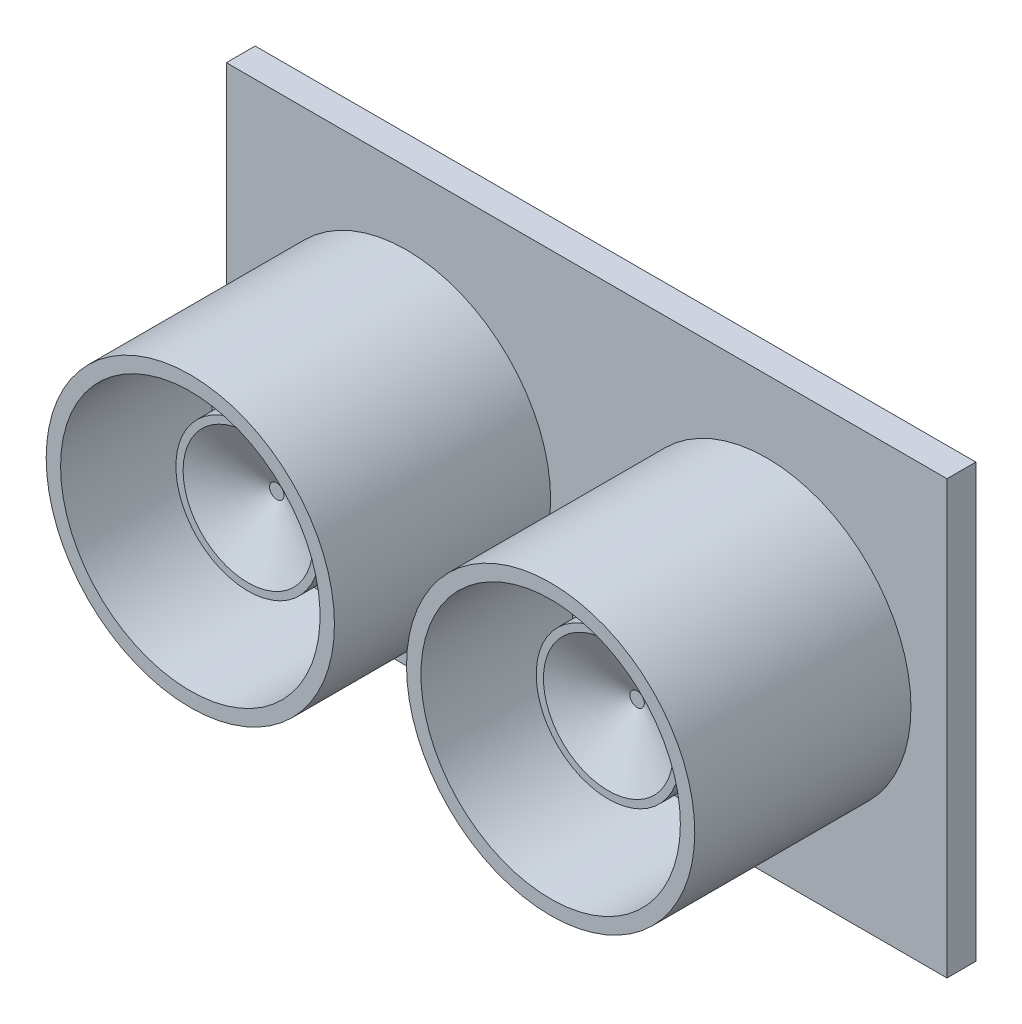
ISO-10303-21;
HEADER;
FILE_DESCRIPTION(('STEP AP214'),'2;1');
FILE_NAME('part.step','',(''),(''),'','','');
FILE_SCHEMA(('AUTOMOTIVE_DESIGN { 1 0 10303 214 1 1 1 1 }'));
ENDSEC;
DATA;
#1=APPLICATION_CONTEXT('core data for automotive mechanical design processes');
#2=APPLICATION_PROTOCOL_DEFINITION('international standard','automotive_design',2000,#1);
#3=PRODUCT_CONTEXT('',#1,'mechanical');
#4=PRODUCT('Part','Part','',(#3));
#5=PRODUCT_RELATED_PRODUCT_CATEGORY('part','',(#4));
#6=PRODUCT_DEFINITION_FORMATION('','',#4);
#7=PRODUCT_DEFINITION_CONTEXT('part definition',#1,'design');
#8=PRODUCT_DEFINITION('design','',#6,#7);
#9=PRODUCT_DEFINITION_SHAPE('','',#8);
#10=(LENGTH_UNIT() NAMED_UNIT(*) SI_UNIT(.MILLI.,.METRE.));
#11=(NAMED_UNIT(*) PLANE_ANGLE_UNIT() SI_UNIT($,.RADIAN.));
#12=(NAMED_UNIT(*) SI_UNIT($,.STERADIAN.) SOLID_ANGLE_UNIT());
#13=UNCERTAINTY_MEASURE_WITH_UNIT(LENGTH_MEASURE(1.E-05),#10,'distance_accuracy_value','');
#14=(GEOMETRIC_REPRESENTATION_CONTEXT(3) GLOBAL_UNCERTAINTY_ASSIGNED_CONTEXT((#13)) GLOBAL_UNIT_ASSIGNED_CONTEXT((#10,
#11,#12)) REPRESENTATION_CONTEXT('',''));
#15=CARTESIAN_POINT('',(0.,0.,0.));
#16=DIRECTION('',(0.,0.,1.));
#17=DIRECTION('',(1.,0.,0.));
#18=AXIS2_PLACEMENT_3D('',#15,#16,#17);
#19=CARTESIAN_POINT('',(25.,-15.,2.));
#20=DIRECTION('',(-1.,0.,0.));
#21=DIRECTION('',(0.,0.,1.));
#22=AXIS2_PLACEMENT_3D('',#19,#20,#21);
#23=PLANE('',#22);
#24=DIRECTION('',(0.,1.,0.));
#25=VECTOR('',#24,1.);
#26=CARTESIAN_POINT('',(25.,-15.,0.));
#27=LINE('',#26,#25);
#28=CARTESIAN_POINT('',(25.,-15.,0.));
#29=VERTEX_POINT('',#28);
#30=CARTESIAN_POINT('',(25.,15.,0.));
#31=VERTEX_POINT('',#30);
#32=EDGE_CURVE('E102',#29,#31,#27,.T.);
#33=ORIENTED_EDGE('',*,*,#32,.T.);
#34=DIRECTION('',(0.,0.,-1.));
#35=VECTOR('',#34,1.);
#36=CARTESIAN_POINT('',(25.,15.,2.));
#37=LINE('',#36,#35);
#38=CARTESIAN_POINT('',(25.,15.,2.));
#39=VERTEX_POINT('',#38);
#40=EDGE_CURVE('E93',#39,#31,#37,.T.);
#41=ORIENTED_EDGE('',*,*,#40,.F.);
#42=DIRECTION('',(0.,1.,0.));
#43=VECTOR('',#42,1.);
#44=CARTESIAN_POINT('',(25.,-15.,2.));
#45=LINE('',#44,#43);
#46=CARTESIAN_POINT('',(25.,-15.,2.));
#47=VERTEX_POINT('',#46);
#48=EDGE_CURVE('E87',#47,#39,#45,.T.);
#49=ORIENTED_EDGE('',*,*,#48,.F.);
#50=DIRECTION('',(0.,0.,-1.));
#51=VECTOR('',#50,1.);
#52=CARTESIAN_POINT('',(25.,-15.,2.));
#53=LINE('',#52,#51);
#54=EDGE_CURVE('E98',#47,#29,#53,.T.);
#55=ORIENTED_EDGE('',*,*,#54,.T.);
#56=EDGE_LOOP('',(#33,#41,#49,#55));
#57=FACE_BOUND('',#56,.T.);
#58=ADVANCED_FACE('F33',(#57),#23,.F.);
#59=CARTESIAN_POINT('',(-25.,15.,2.));
#60=DIRECTION('',(0.,-1.,0.));
#61=DIRECTION('',(0.,0.,-1.));
#62=AXIS2_PLACEMENT_3D('',#59,#60,#61);
#63=PLANE('',#62);
#64=DIRECTION('',(-1.,0.,0.));
#65=VECTOR('',#64,1.);
#66=CARTESIAN_POINT('',(-25.,15.,0.));
#67=LINE('',#66,#65);
#68=CARTESIAN_POINT('',(-25.,15.,0.));
#69=VERTEX_POINT('',#68);
#70=EDGE_CURVE('E92',#31,#69,#67,.T.);
#71=ORIENTED_EDGE('',*,*,#70,.T.);
#72=DIRECTION('',(0.,0.,-1.));
#73=VECTOR('',#72,1.);
#74=CARTESIAN_POINT('',(-25.,15.,2.));
#75=LINE('',#74,#73);
#76=CARTESIAN_POINT('',(-25.,15.,2.));
#77=VERTEX_POINT('',#76);
#78=EDGE_CURVE('E90',#77,#69,#75,.T.);
#79=ORIENTED_EDGE('',*,*,#78,.F.);
#80=DIRECTION('',(-1.,0.,0.));
#81=VECTOR('',#80,1.);
#82=CARTESIAN_POINT('',(-25.,15.,2.));
#83=LINE('',#82,#81);
#84=EDGE_CURVE('E82',#39,#77,#83,.T.);
#85=ORIENTED_EDGE('',*,*,#84,.F.);
#86=ORIENTED_EDGE('',*,*,#40,.T.);
#87=EDGE_LOOP('',(#71,#79,#85,#86));
#88=FACE_BOUND('',#87,.T.);
#89=ADVANCED_FACE('F91',(#88),#63,.F.);
#90=CARTESIAN_POINT('',(-25.,-15.,2.));
#91=DIRECTION('',(1.,0.,0.));
#92=DIRECTION('',(0.,0.,-1.));
#93=AXIS2_PLACEMENT_3D('',#90,#91,#92);
#94=PLANE('',#93);
#95=DIRECTION('',(0.,-1.,0.));
#96=VECTOR('',#95,1.);
#97=CARTESIAN_POINT('',(-25.,-15.,0.));
#98=LINE('',#97,#96);
#99=CARTESIAN_POINT('',(-25.,-15.,0.));
#100=VERTEX_POINT('',#99);
#101=EDGE_CURVE('E68',#69,#100,#98,.T.);
#102=ORIENTED_EDGE('',*,*,#101,.T.);
#103=DIRECTION('',(0.,0.,-1.));
#104=VECTOR('',#103,1.);
#105=CARTESIAN_POINT('',(-25.,-15.,2.));
#106=LINE('',#105,#104);
#107=CARTESIAN_POINT('',(-25.,-15.,2.));
#108=VERTEX_POINT('',#107);
#109=EDGE_CURVE('E94',#108,#100,#106,.T.);
#110=ORIENTED_EDGE('',*,*,#109,.F.);
#111=DIRECTION('',(0.,-1.,0.));
#112=VECTOR('',#111,1.);
#113=CARTESIAN_POINT('',(-25.,-15.,2.));
#114=LINE('',#113,#112);
#115=EDGE_CURVE('E85',#77,#108,#114,.T.);
#116=ORIENTED_EDGE('',*,*,#115,.F.);
#117=ORIENTED_EDGE('',*,*,#78,.T.);
#118=EDGE_LOOP('',(#102,#110,#116,#117));
#119=FACE_BOUND('',#118,.T.);
#120=ADVANCED_FACE('F96',(#119),#94,.F.);
#121=CARTESIAN_POINT('',(-25.,-15.,2.));
#122=DIRECTION('',(0.,1.,0.));
#123=DIRECTION('',(0.,0.,1.));
#124=AXIS2_PLACEMENT_3D('',#121,#122,#123);
#125=PLANE('',#124);
#126=DIRECTION('',(1.,0.,0.));
#127=VECTOR('',#126,1.);
#128=CARTESIAN_POINT('',(-25.,-15.,0.));
#129=LINE('',#128,#127);
#130=EDGE_CURVE('E74',#100,#29,#129,.T.);
#131=ORIENTED_EDGE('',*,*,#130,.T.);
#132=ORIENTED_EDGE('',*,*,#54,.F.);
#133=DIRECTION('',(1.,0.,0.));
#134=VECTOR('',#133,1.);
#135=CARTESIAN_POINT('',(-25.,-15.,2.));
#136=LINE('',#135,#134);
#137=EDGE_CURVE('E51',#108,#47,#136,.T.);
#138=ORIENTED_EDGE('',*,*,#137,.F.);
#139=ORIENTED_EDGE('',*,*,#109,.T.);
#140=EDGE_LOOP('',(#131,#132,#138,#139));
#141=FACE_BOUND('',#140,.T.);
#142=ADVANCED_FACE('F167',(#141),#125,.F.);
#143=CARTESIAN_POINT('',(0.,0.,2.));
#144=DIRECTION('',(0.,0.,-1.));
#145=DIRECTION('',(-1.,0.,0.));
#146=AXIS2_PLACEMENT_3D('',#143,#144,#145);
#147=PLANE('',#146);
#148=CARTESIAN_POINT('',(-12.5,0.,2.));
#149=DIRECTION('',(0.,0.,-1.));
#150=DIRECTION('',(-1.,0.,0.));
#151=AXIS2_PLACEMENT_3D('',#148,#149,#150);
#152=CIRCLE('',#151,10.);
#153=CARTESIAN_POINT('',(-22.5,0.,2.));
#154=VERTEX_POINT('',#153);
#155=EDGE_CURVE('E115',#154,#154,#152,.F.);
#156=ORIENTED_EDGE('',*,*,#155,.F.);
#157=EDGE_LOOP('',(#156));
#158=FACE_BOUND('',#157,.T.);
#159=CARTESIAN_POINT('',(12.5,0.,2.));
#160=DIRECTION('',(0.,0.,-1.));
#161=DIRECTION('',(-1.,0.,0.));
#162=AXIS2_PLACEMENT_3D('',#159,#160,#161);
#163=CIRCLE('',#162,10.);
#164=CARTESIAN_POINT('',(2.50000000000001,0.,2.));
#165=VERTEX_POINT('',#164);
#166=EDGE_CURVE('E112',#165,#165,#163,.F.);
#167=ORIENTED_EDGE('',*,*,#166,.F.);
#168=EDGE_LOOP('',(#167));
#169=FACE_BOUND('',#168,.T.);
#170=ORIENTED_EDGE('',*,*,#48,.T.);
#171=ORIENTED_EDGE('',*,*,#84,.T.);
#172=ORIENTED_EDGE('',*,*,#115,.T.);
#173=ORIENTED_EDGE('',*,*,#137,.T.);
#174=EDGE_LOOP('',(#170,#171,#172,#173));
#175=FACE_BOUND('',#174,.T.);
#176=ADVANCED_FACE('F83',(#158,#169,#175),#147,.F.);
#177=CARTESIAN_POINT('',(0.,0.,0.));
#178=DIRECTION('',(0.,0.,-1.));
#179=DIRECTION('',(-1.,0.,0.));
#180=AXIS2_PLACEMENT_3D('',#177,#178,#179);
#181=PLANE('',#180);
#182=ORIENTED_EDGE('',*,*,#32,.F.);
#183=ORIENTED_EDGE('',*,*,#130,.F.);
#184=ORIENTED_EDGE('',*,*,#101,.F.);
#185=ORIENTED_EDGE('',*,*,#70,.F.);
#186=EDGE_LOOP('',(#182,#183,#184,#185));
#187=FACE_BOUND('',#186,.T.);
#188=ADVANCED_FACE('F166',(#187),#181,.T.);
#189=CARTESIAN_POINT('',(12.5,0.,17.));
#190=DIRECTION('',(0.,0.,1.));
#191=DIRECTION('',(1.,0.,0.));
#192=AXIS2_PLACEMENT_3D('',#189,#190,#191);
#193=PLANE('',#192);
#194=CARTESIAN_POINT('',(12.5,0.,17.));
#195=DIRECTION('',(0.,0.,1.));
#196=DIRECTION('',(1.,0.,0.));
#197=AXIS2_PLACEMENT_3D('',#194,#195,#196);
#198=CIRCLE('',#197,10.);
#199=CARTESIAN_POINT('',(22.5,0.,17.));
#200=VERTEX_POINT('',#199);
#201=EDGE_CURVE('E105',#200,#200,#198,.T.);
#202=ORIENTED_EDGE('',*,*,#201,.T.);
#203=EDGE_LOOP('',(#202));
#204=FACE_BOUND('',#203,.T.);
#205=CARTESIAN_POINT('',(12.5,0.,17.));
#206=DIRECTION('',(0.,0.,1.));
#207=DIRECTION('',(1.,0.,0.));
#208=AXIS2_PLACEMENT_3D('',#205,#206,#207);
#209=CIRCLE('',#208,9.);
#210=CARTESIAN_POINT('',(21.5,0.,17.));
#211=VERTEX_POINT('',#210);
#212=EDGE_CURVE('E147',#211,#211,#209,.T.);
#213=ORIENTED_EDGE('',*,*,#212,.F.);
#214=EDGE_LOOP('',(#213));
#215=FACE_BOUND('',#214,.T.);
#216=ADVANCED_FACE('F155',(#204,#215),#193,.T.);
#217=CARTESIAN_POINT('',(12.5,0.,17.));
#218=DIRECTION('',(0.,0.,-1.));
#219=DIRECTION('',(-1.,0.,0.));
#220=AXIS2_PLACEMENT_3D('',#217,#218,#219);
#221=CYLINDRICAL_SURFACE('',#220,10.);
#222=ORIENTED_EDGE('',*,*,#201,.F.);
#223=EDGE_LOOP('',(#222));
#224=FACE_BOUND('',#223,.T.);
#225=ORIENTED_EDGE('',*,*,#166,.T.);
#226=EDGE_LOOP('',(#225));
#227=FACE_BOUND('',#226,.T.);
#228=ADVANCED_FACE('F158',(#224,#227),#221,.T.);
#229=CARTESIAN_POINT('',(12.5,0.,17.));
#230=DIRECTION('',(0.,0.,-1.));
#231=DIRECTION('',(-1.,0.,0.));
#232=AXIS2_PLACEMENT_3D('',#229,#230,#231);
#233=CYLINDRICAL_SURFACE('',#232,9.);
#234=ORIENTED_EDGE('',*,*,#212,.T.);
#235=EDGE_LOOP('',(#234));
#236=FACE_BOUND('',#235,.T.);
#237=CARTESIAN_POINT('',(12.5,0.,2.));
#238=DIRECTION('',(0.,0.,1.));
#239=DIRECTION('',(1.,0.,0.));
#240=AXIS2_PLACEMENT_3D('',#237,#238,#239);
#241=CIRCLE('',#240,9.);
#242=CARTESIAN_POINT('',(21.5,0.,2.));
#243=VERTEX_POINT('',#242);
#244=EDGE_CURVE('E146',#243,#243,#241,.T.);
#245=ORIENTED_EDGE('',*,*,#244,.F.);
#246=EDGE_LOOP('',(#245));
#247=FACE_BOUND('',#246,.T.);
#248=ADVANCED_FACE('F161',(#236,#247),#233,.F.);
#249=CARTESIAN_POINT('',(12.5,0.,2.));
#250=DIRECTION('',(0.,0.,-1.));
#251=DIRECTION('',(-1.,0.,0.));
#252=AXIS2_PLACEMENT_3D('',#249,#250,#251);
#253=CIRCLE('',#252,7.5);
#254=CARTESIAN_POINT('',(5.00000000000001,0.,2.));
#255=VERTEX_POINT('',#254);
#256=EDGE_CURVE('E117',#255,#255,#253,.F.);
#257=ORIENTED_EDGE('',*,*,#256,.F.);
#258=EDGE_LOOP('',(#257));
#259=FACE_BOUND('',#258,.T.);
#260=ORIENTED_EDGE('',*,*,#244,.T.);
#261=EDGE_LOOP('',(#260));
#262=FACE_BOUND('',#261,.T.);
#263=ADVANCED_FACE('F171',(#259,#262),#147,.F.);
#264=CARTESIAN_POINT('',(-12.5,0.,17.));
#265=DIRECTION('',(0.,0.,-1.));
#266=DIRECTION('',(-1.,0.,0.));
#267=AXIS2_PLACEMENT_3D('',#264,#265,#266);
#268=PLANE('',#267);
#269=CARTESIAN_POINT('',(-12.5,0.,17.));
#270=DIRECTION('',(0.,0.,1.));
#271=DIRECTION('',(-1.,0.,0.));
#272=AXIS2_PLACEMENT_3D('',#269,#270,#271);
#273=CIRCLE('',#272,10.);
#274=CARTESIAN_POINT('',(-22.5,0.,17.));
#275=VERTEX_POINT('',#274);
#276=EDGE_CURVE('E141',#275,#275,#273,.T.);
#277=ORIENTED_EDGE('',*,*,#276,.T.);
#278=EDGE_LOOP('',(#277));
#279=FACE_BOUND('',#278,.T.);
#280=CARTESIAN_POINT('',(-12.5,0.,17.));
#281=DIRECTION('',(0.,0.,1.));
#282=DIRECTION('',(-1.,0.,0.));
#283=AXIS2_PLACEMENT_3D('',#280,#281,#282);
#284=CIRCLE('',#283,9.);
#285=CARTESIAN_POINT('',(-21.5,0.,17.));
#286=VERTEX_POINT('',#285);
#287=EDGE_CURVE('E138',#286,#286,#284,.T.);
#288=ORIENTED_EDGE('',*,*,#287,.F.);
#289=EDGE_LOOP('',(#288));
#290=FACE_BOUND('',#289,.T.);
#291=ADVANCED_FACE('F185',(#279,#290),#268,.F.);
#292=CARTESIAN_POINT('',(-12.5,0.,17.));
#293=DIRECTION('',(0.,0.,-1.));
#294=DIRECTION('',(-1.,0.,0.));
#295=AXIS2_PLACEMENT_3D('',#292,#293,#294);
#296=CYLINDRICAL_SURFACE('',#295,10.);
#297=ORIENTED_EDGE('',*,*,#276,.F.);
#298=EDGE_LOOP('',(#297));
#299=FACE_BOUND('',#298,.T.);
#300=ORIENTED_EDGE('',*,*,#155,.T.);
#301=EDGE_LOOP('',(#300));
#302=FACE_BOUND('',#301,.T.);
#303=ADVANCED_FACE('F247',(#299,#302),#296,.T.);
#304=CARTESIAN_POINT('',(-12.5,0.,17.));
#305=DIRECTION('',(0.,0.,-1.));
#306=DIRECTION('',(-1.,0.,0.));
#307=AXIS2_PLACEMENT_3D('',#304,#305,#306);
#308=CYLINDRICAL_SURFACE('',#307,9.);
#309=ORIENTED_EDGE('',*,*,#287,.T.);
#310=EDGE_LOOP('',(#309));
#311=FACE_BOUND('',#310,.T.);
#312=CARTESIAN_POINT('',(-12.5,0.,2.));
#313=DIRECTION('',(0.,0.,1.));
#314=DIRECTION('',(-1.,0.,0.));
#315=AXIS2_PLACEMENT_3D('',#312,#313,#314);
#316=CIRCLE('',#315,9.);
#317=CARTESIAN_POINT('',(-21.5,0.,2.));
#318=VERTEX_POINT('',#317);
#319=EDGE_CURVE('E137',#318,#318,#316,.T.);
#320=ORIENTED_EDGE('',*,*,#319,.F.);
#321=EDGE_LOOP('',(#320));
#322=FACE_BOUND('',#321,.T.);
#323=ADVANCED_FACE('F182',(#311,#322),#308,.F.);
#324=CARTESIAN_POINT('',(-12.5,0.,2.));
#325=DIRECTION('',(0.,0.,-1.));
#326=DIRECTION('',(-1.,0.,0.));
#327=AXIS2_PLACEMENT_3D('',#324,#325,#326);
#328=CIRCLE('',#327,7.5);
#329=CARTESIAN_POINT('',(-20.,0.,2.));
#330=VERTEX_POINT('',#329);
#331=EDGE_CURVE('E36',#330,#330,#328,.F.);
#332=ORIENTED_EDGE('',*,*,#331,.F.);
#333=EDGE_LOOP('',(#332));
#334=FACE_BOUND('',#333,.T.);
#335=ORIENTED_EDGE('',*,*,#319,.T.);
#336=EDGE_LOOP('',(#335));
#337=FACE_BOUND('',#336,.T.);
#338=ADVANCED_FACE('F170',(#334,#337),#147,.F.);
#339=CARTESIAN_POINT('',(12.5,0.,8.));
#340=DIRECTION('',(0.,0.,-1.));
#341=DIRECTION('',(-1.,0.,0.));
#342=AXIS2_PLACEMENT_3D('',#339,#340,#341);
#343=CYLINDRICAL_SURFACE('',#342,7.5);
#344=CARTESIAN_POINT('',(12.5,0.,8.));
#345=DIRECTION('',(0.,0.,1.));
#346=DIRECTION('',(1.,0.,0.));
#347=AXIS2_PLACEMENT_3D('',#344,#345,#346);
#348=CIRCLE('',#347,7.5);
#349=CARTESIAN_POINT('',(20.,0.,8.));
#350=VERTEX_POINT('',#349);
#351=EDGE_CURVE('E134',#350,#350,#348,.T.);
#352=ORIENTED_EDGE('',*,*,#351,.F.);
#353=EDGE_LOOP('',(#352));
#354=FACE_BOUND('',#353,.T.);
#355=ORIENTED_EDGE('',*,*,#256,.T.);
#356=EDGE_LOOP('',(#355));
#357=FACE_BOUND('',#356,.T.);
#358=ADVANCED_FACE('F181',(#354,#357),#343,.T.);
#359=CARTESIAN_POINT('',(12.5,0.,8.));
#360=DIRECTION('',(0.,0.,1.));
#361=DIRECTION('',(1.,0.,0.));
#362=AXIS2_PLACEMENT_3D('',#359,#360,#361);
#363=PLANE('',#362);
#364=CARTESIAN_POINT('',(12.5,0.,8.));
#365=DIRECTION('',(0.,0.,1.));
#366=DIRECTION('',(1.,0.,0.));
#367=AXIS2_PLACEMENT_3D('',#364,#365,#366);
#368=CIRCLE('',#367,5.);
#369=CARTESIAN_POINT('',(17.5,0.,8.));
#370=VERTEX_POINT('',#369);
#371=EDGE_CURVE('E11',#370,#370,#368,.T.);
#372=ORIENTED_EDGE('',*,*,#371,.F.);
#373=EDGE_LOOP('',(#372));
#374=FACE_BOUND('',#373,.T.);
#375=ORIENTED_EDGE('',*,*,#351,.T.);
#376=EDGE_LOOP('',(#375));
#377=FACE_BOUND('',#376,.T.);
#378=ADVANCED_FACE('F285',(#374,#377),#363,.T.);
#379=CARTESIAN_POINT('',(-12.5,0.,8.));
#380=DIRECTION('',(0.,0.,-1.));
#381=DIRECTION('',(-1.,0.,0.));
#382=AXIS2_PLACEMENT_3D('',#379,#380,#381);
#383=CYLINDRICAL_SURFACE('',#382,7.5);
#384=CARTESIAN_POINT('',(-12.5,0.,8.));
#385=DIRECTION('',(0.,0.,1.));
#386=DIRECTION('',(1.,0.,0.));
#387=AXIS2_PLACEMENT_3D('',#384,#385,#386);
#388=CIRCLE('',#387,7.5);
#389=CARTESIAN_POINT('',(-5.00000000000001,0.,8.));
#390=VERTEX_POINT('',#389);
#391=EDGE_CURVE('E131',#390,#390,#388,.T.);
#392=ORIENTED_EDGE('',*,*,#391,.F.);
#393=EDGE_LOOP('',(#392));
#394=FACE_BOUND('',#393,.T.);
#395=ORIENTED_EDGE('',*,*,#331,.T.);
#396=EDGE_LOOP('',(#395));
#397=FACE_BOUND('',#396,.T.);
#398=ADVANCED_FACE('F293',(#394,#397),#383,.T.);
#399=CARTESIAN_POINT('',(-12.5,0.,8.));
#400=DIRECTION('',(0.,0.,1.));
#401=DIRECTION('',(1.,0.,0.));
#402=AXIS2_PLACEMENT_3D('',#399,#400,#401);
#403=PLANE('',#402);
#404=CARTESIAN_POINT('',(-12.5,0.,8.));
#405=DIRECTION('',(0.,0.,1.));
#406=DIRECTION('',(1.,0.,0.));
#407=AXIS2_PLACEMENT_3D('',#404,#405,#406);
#408=CIRCLE('',#407,5.);
#409=CARTESIAN_POINT('',(-7.50000000000001,0.,8.));
#410=VERTEX_POINT('',#409);
#411=EDGE_CURVE('E42',#410,#410,#408,.T.);
#412=ORIENTED_EDGE('',*,*,#411,.F.);
#413=EDGE_LOOP('',(#412));
#414=FACE_BOUND('',#413,.T.);
#415=ORIENTED_EDGE('',*,*,#391,.T.);
#416=EDGE_LOOP('',(#415));
#417=FACE_BOUND('',#416,.T.);
#418=ADVANCED_FACE('F298',(#414,#417),#403,.T.);
#419=CARTESIAN_POINT('',(-12.5,0.,13.));
#420=DIRECTION('',(0.,0.,-1.));
#421=DIRECTION('',(-1.,0.,0.));
#422=AXIS2_PLACEMENT_3D('',#419,#420,#421);
#423=CYLINDRICAL_SURFACE('',#422,5.);
#424=CARTESIAN_POINT('',(-12.5,0.,13.));
#425=DIRECTION('',(0.,0.,1.));
#426=DIRECTION('',(1.,0.,0.));
#427=AXIS2_PLACEMENT_3D('',#424,#425,#426);
#428=CIRCLE('',#427,5.);
#429=CARTESIAN_POINT('',(-7.50000000000001,0.,13.));
#430=VERTEX_POINT('',#429);
#431=EDGE_CURVE('E130',#430,#430,#428,.T.);
#432=ORIENTED_EDGE('',*,*,#431,.F.);
#433=EDGE_LOOP('',(#432));
#434=FACE_BOUND('',#433,.T.);
#435=ORIENTED_EDGE('',*,*,#411,.T.);
#436=EDGE_LOOP('',(#435));
#437=FACE_BOUND('',#436,.T.);
#438=ADVANCED_FACE('F315',(#434,#437),#423,.T.);
#439=CARTESIAN_POINT('',(-12.5,0.,13.));
#440=DIRECTION('',(0.,0.,1.));
#441=DIRECTION('',(1.,0.,0.));
#442=AXIS2_PLACEMENT_3D('',#439,#440,#441);
#443=PLANE('',#442);
#444=CARTESIAN_POINT('',(-12.5,0.,13.));
#445=DIRECTION('',(0.,0.,-1.));
#446=DIRECTION('',(-1.,0.,0.));
#447=AXIS2_PLACEMENT_3D('',#444,#445,#446);
#448=CIRCLE('',#447,4.5);
#449=CARTESIAN_POINT('',(-17.,0.,13.));
#450=VERTEX_POINT('',#449);
#451=EDGE_CURVE('E402',#450,#450,#448,.T.);
#452=ORIENTED_EDGE('',*,*,#451,.T.);
#453=EDGE_LOOP('',(#452));
#454=FACE_BOUND('',#453,.T.);
#455=ORIENTED_EDGE('',*,*,#431,.T.);
#456=EDGE_LOOP('',(#455));
#457=FACE_BOUND('',#456,.T.);
#458=ADVANCED_FACE('F325',(#454,#457),#443,.T.);
#459=CARTESIAN_POINT('',(12.5,0.,13.));
#460=DIRECTION('',(0.,0.,-1.));
#461=DIRECTION('',(-1.,0.,0.));
#462=AXIS2_PLACEMENT_3D('',#459,#460,#461);
#463=CYLINDRICAL_SURFACE('',#462,5.);
#464=CARTESIAN_POINT('',(12.5,0.,13.));
#465=DIRECTION('',(0.,0.,1.));
#466=DIRECTION('',(1.,0.,0.));
#467=AXIS2_PLACEMENT_3D('',#464,#465,#466);
#468=CIRCLE('',#467,5.);
#469=CARTESIAN_POINT('',(17.5,0.,13.));
#470=VERTEX_POINT('',#469);
#471=EDGE_CURVE('E413',#470,#470,#468,.T.);
#472=ORIENTED_EDGE('',*,*,#471,.F.);
#473=EDGE_LOOP('',(#472));
#474=FACE_BOUND('',#473,.T.);
#475=ORIENTED_EDGE('',*,*,#371,.T.);
#476=EDGE_LOOP('',(#475));
#477=FACE_BOUND('',#476,.T.);
#478=ADVANCED_FACE('F333',(#474,#477),#463,.T.);
#479=CARTESIAN_POINT('',(12.5,0.,13.));
#480=DIRECTION('',(0.,0.,1.));
#481=DIRECTION('',(1.,0.,0.));
#482=AXIS2_PLACEMENT_3D('',#479,#480,#481);
#483=PLANE('',#482);
#484=CARTESIAN_POINT('',(12.5,0.,13.));
#485=DIRECTION('',(0.,0.,1.));
#486=DIRECTION('',(1.,0.,0.));
#487=AXIS2_PLACEMENT_3D('',#484,#485,#486);
#488=CIRCLE('',#487,4.5);
#489=CARTESIAN_POINT('',(17.,0.,13.));
#490=VERTEX_POINT('',#489);
#491=EDGE_CURVE('E410',#490,#490,#488,.T.);
#492=ORIENTED_EDGE('',*,*,#491,.F.);
#493=EDGE_LOOP('',(#492));
#494=FACE_BOUND('',#493,.T.);
#495=ORIENTED_EDGE('',*,*,#471,.T.);
#496=EDGE_LOOP('',(#495));
#497=FACE_BOUND('',#496,.T.);
#498=ADVANCED_FACE('F338',(#494,#497),#483,.T.);
#499=CARTESIAN_POINT('',(12.5,0.,13.));
#500=DIRECTION('',(0.,0.,1.));
#501=DIRECTION('',(1.,0.,0.));
#502=AXIS2_PLACEMENT_3D('',#499,#500,#501);
#503=CONICAL_SURFACE('',#502,4.5,1.10714871779409);
#504=CARTESIAN_POINT('',(12.5,0.,11.));
#505=DIRECTION('',(0.,0.,1.));
#506=DIRECTION('',(1.,0.,0.));
#507=AXIS2_PLACEMENT_3D('',#504,#505,#506);
#508=CIRCLE('',#507,0.5);
#509=CARTESIAN_POINT('',(13.,0.,11.));
#510=VERTEX_POINT('',#509);
#511=EDGE_CURVE('E405',#510,#510,#508,.T.);
#512=CARTESIAN_POINT('',(13.,0.,11.));
#513=CARTESIAN_POINT('',(13.0416666666667,0.,11.0208333333333));
#514=CARTESIAN_POINT('',(13.0833333333333,0.,11.0416666666667));
#515=CARTESIAN_POINT('',(13.1666666666667,0.,11.0833333333333));
#516=CARTESIAN_POINT('',(13.2083333333333,0.,11.1041666666667));
#517=CARTESIAN_POINT('',(13.2916666666667,0.,11.1458333333333));
#518=CARTESIAN_POINT('',(13.3333333333333,0.,11.1666666666667));
#519=CARTESIAN_POINT('',(13.4166666666667,0.,11.2083333333333));
#520=CARTESIAN_POINT('',(13.4583333333333,0.,11.2291666666667));
#521=CARTESIAN_POINT('',(13.5416666666667,0.,11.2708333333333));
#522=CARTESIAN_POINT('',(13.5833333333333,0.,11.2916666666667));
#523=CARTESIAN_POINT('',(13.6666666666667,0.,11.3333333333333));
#524=CARTESIAN_POINT('',(13.7083333333333,0.,11.3541666666667));
#525=CARTESIAN_POINT('',(13.7916666666667,0.,11.3958333333333));
#526=CARTESIAN_POINT('',(13.8333333333333,0.,11.4166666666667));
#527=CARTESIAN_POINT('',(13.9166666666667,0.,11.4583333333333));
#528=CARTESIAN_POINT('',(13.9583333333333,0.,11.4791666666667));
#529=CARTESIAN_POINT('',(14.0416666666667,0.,11.5208333333333));
#530=CARTESIAN_POINT('',(14.0833333333333,0.,11.5416666666667));
#531=CARTESIAN_POINT('',(14.1666666666667,0.,11.5833333333333));
#532=CARTESIAN_POINT('',(14.2083333333333,0.,11.6041666666667));
#533=CARTESIAN_POINT('',(14.2916666666667,0.,11.6458333333333));
#534=CARTESIAN_POINT('',(14.3333333333333,0.,11.6666666666667));
#535=CARTESIAN_POINT('',(14.4166666666667,0.,11.7083333333333));
#536=CARTESIAN_POINT('',(14.4583333333333,0.,11.7291666666667));
#537=CARTESIAN_POINT('',(14.5416666666667,0.,11.7708333333333));
#538=CARTESIAN_POINT('',(14.5833333333333,0.,11.7916666666667));
#539=CARTESIAN_POINT('',(14.6666666666667,0.,11.8333333333333));
#540=CARTESIAN_POINT('',(14.7083333333333,0.,11.8541666666667));
#541=CARTESIAN_POINT('',(14.7916666666667,0.,11.8958333333333));
#542=CARTESIAN_POINT('',(14.8333333333333,0.,11.9166666666667));
#543=CARTESIAN_POINT('',(14.9166666666667,0.,11.9583333333333));
#544=CARTESIAN_POINT('',(14.9583333333333,0.,11.9791666666667));
#545=CARTESIAN_POINT('',(15.0416666666667,0.,12.0208333333333));
#546=CARTESIAN_POINT('',(15.0833333333333,0.,12.0416666666667));
#547=CARTESIAN_POINT('',(15.1666666666667,0.,12.0833333333333));
#548=CARTESIAN_POINT('',(15.2083333333333,0.,12.1041666666667));
#549=CARTESIAN_POINT('',(15.2916666666667,0.,12.1458333333333));
#550=CARTESIAN_POINT('',(15.3333333333333,0.,12.1666666666667));
#551=CARTESIAN_POINT('',(15.4166666666667,0.,12.2083333333333));
#552=CARTESIAN_POINT('',(15.4583333333333,0.,12.2291666666667));
#553=CARTESIAN_POINT('',(15.5416666666667,0.,12.2708333333333));
#554=CARTESIAN_POINT('',(15.5833333333333,0.,12.2916666666667));
#555=CARTESIAN_POINT('',(15.6666666666667,0.,12.3333333333333));
#556=CARTESIAN_POINT('',(15.7083333333333,0.,12.3541666666667));
#557=CARTESIAN_POINT('',(15.7916666666667,0.,12.3958333333333));
#558=CARTESIAN_POINT('',(15.8333333333333,0.,12.4166666666667));
#559=CARTESIAN_POINT('',(15.9166666666667,0.,12.4583333333333));
#560=CARTESIAN_POINT('',(15.9583333333333,0.,12.4791666666667));
#561=CARTESIAN_POINT('',(16.0416666666667,0.,12.5208333333333));
#562=CARTESIAN_POINT('',(16.0833333333333,0.,12.5416666666667));
#563=CARTESIAN_POINT('',(16.1666666666667,0.,12.5833333333333));
#564=CARTESIAN_POINT('',(16.2083333333333,0.,12.6041666666667));
#565=CARTESIAN_POINT('',(16.2916666666667,0.,12.6458333333333));
#566=CARTESIAN_POINT('',(16.3333333333333,0.,12.6666666666667));
#567=CARTESIAN_POINT('',(16.4166666666667,0.,12.7083333333333));
#568=CARTESIAN_POINT('',(16.4583333333333,0.,12.7291666666667));
#569=CARTESIAN_POINT('',(16.5416666666667,0.,12.7708333333333));
#570=CARTESIAN_POINT('',(16.5833333333333,0.,12.7916666666667));
#571=CARTESIAN_POINT('',(16.6666666666667,0.,12.8333333333333));
#572=CARTESIAN_POINT('',(16.7083333333333,0.,12.8541666666667));
#573=CARTESIAN_POINT('',(16.7916666666667,0.,12.8958333333333));
#574=CARTESIAN_POINT('',(16.8333333333333,0.,12.9166666666667));
#575=CARTESIAN_POINT('',(16.9166666666667,0.,12.9583333333333));
#576=CARTESIAN_POINT('',(16.9583333333333,0.,12.9791666666667));
#577=CARTESIAN_POINT('',(17.,0.,13.));
#578=B_SPLINE_CURVE_WITH_KNOTS('',3,(#512,#513,#514,#515,#516,#517,#518,#519,#520,#521,#522,
#523,#524,#525,#526,#527,#528,#529,#530,#531,#532,#533,#534,#535,#536,#537,#538,#539,#540,#541,
#542,#543,#544,#545,#546,#547,#548,#549,#550,#551,#552,#553,#554,#555,#556,#557,#558,#559,#560,
#561,#562,#563,#564,#565,#566,#567,#568,#569,#570,#571,#572,#573,#574,#575,#576,#577),
.UNSPECIFIED.,.F.,.F.,(4,2,2,2,2,2,2,2,2,2,2,2,2,2,2,2,2,2,2,2,2,2,2,2,2,2,2,2,2,2,2,2,4),(0.,
0.139754248593737,0.279508497187474,0.419262745781209,0.559016994374946,0.698771242968684,
0.838525491562421,0.978279740156158,1.11803398874989,1.25778823734363,1.39754248593737,
1.5372967345311,1.67705098312484,1.81680523171858,1.95655948031231,2.09631372890605,
2.23606797749979,2.37582222609353,2.51557647468726,2.655330723281,2.79508497187474,
2.93483922046847,3.07459346906221,3.21434771765595,3.35410196624968,3.49385621484342,
3.63361046343716,3.77336471203089,3.91311896062463,4.05287320921837,4.1926274578121,
4.33238170640584,4.47213595499958),.UNSPECIFIED.);
#579=EDGE_CURVE('BSEAM348',#510,#490,#578,.T.);
#580=ORIENTED_EDGE('',*,*,#511,.F.);
#581=ORIENTED_EDGE('',*,*,#491,.T.);
#582=ORIENTED_EDGE('',*,*,#579,.T.);
#583=ORIENTED_EDGE('',*,*,#579,.F.);
#584=EDGE_LOOP('',(#580,#582,#581,#583));
#585=FACE_BOUND('',#584,.T.);
#586=ADVANCED_FACE('F348',(#585),#503,.F.);
#587=CARTESIAN_POINT('',(12.5,0.,11.));
#588=DIRECTION('',(0.,0.,-1.));
#589=DIRECTION('',(-1.,0.,0.));
#590=AXIS2_PLACEMENT_3D('',#587,#588,#589);
#591=PLANE('',#590);
#592=ORIENTED_EDGE('',*,*,#511,.T.);
#593=EDGE_LOOP('',(#592));
#594=FACE_BOUND('',#593,.T.);
#595=ADVANCED_FACE('F358',(#594),#591,.F.);
#596=CARTESIAN_POINT('',(-12.5,0.,13.));
#597=DIRECTION('',(0.,0.,1.));
#598=DIRECTION('',(-1.,0.,0.));
#599=AXIS2_PLACEMENT_3D('',#596,#597,#598);
#600=CONICAL_SURFACE('',#599,4.5,1.10714871779409);
#601=CARTESIAN_POINT('',(-12.5,0.,11.));
#602=DIRECTION('',(0.,0.,-1.));
#603=DIRECTION('',(-1.,0.,0.));
#604=AXIS2_PLACEMENT_3D('',#601,#602,#603);
#605=CIRCLE('',#604,0.5);
#606=CARTESIAN_POINT('',(-13.,0.,11.));
#607=VERTEX_POINT('',#606);
#608=EDGE_CURVE('E401',#607,#607,#605,.T.);
#609=CARTESIAN_POINT('',(-13.,0.,11.));
#610=CARTESIAN_POINT('',(-13.0416666666667,0.,11.0208333333333));
#611=CARTESIAN_POINT('',(-13.0833333333333,0.,11.0416666666667));
#612=CARTESIAN_POINT('',(-13.1666666666667,0.,11.0833333333333));
#613=CARTESIAN_POINT('',(-13.2083333333333,0.,11.1041666666667));
#614=CARTESIAN_POINT('',(-13.2916666666667,0.,11.1458333333333));
#615=CARTESIAN_POINT('',(-13.3333333333333,0.,11.1666666666667));
#616=CARTESIAN_POINT('',(-13.4166666666667,0.,11.2083333333333));
#617=CARTESIAN_POINT('',(-13.4583333333333,0.,11.2291666666667));
#618=CARTESIAN_POINT('',(-13.5416666666667,0.,11.2708333333333));
#619=CARTESIAN_POINT('',(-13.5833333333333,0.,11.2916666666667));
#620=CARTESIAN_POINT('',(-13.6666666666667,0.,11.3333333333333));
#621=CARTESIAN_POINT('',(-13.7083333333333,0.,11.3541666666667));
#622=CARTESIAN_POINT('',(-13.7916666666667,0.,11.3958333333333));
#623=CARTESIAN_POINT('',(-13.8333333333333,0.,11.4166666666667));
#624=CARTESIAN_POINT('',(-13.9166666666667,0.,11.4583333333333));
#625=CARTESIAN_POINT('',(-13.9583333333333,0.,11.4791666666667));
#626=CARTESIAN_POINT('',(-14.0416666666667,0.,11.5208333333333));
#627=CARTESIAN_POINT('',(-14.0833333333333,0.,11.5416666666667));
#628=CARTESIAN_POINT('',(-14.1666666666667,0.,11.5833333333333));
#629=CARTESIAN_POINT('',(-14.2083333333333,0.,11.6041666666667));
#630=CARTESIAN_POINT('',(-14.2916666666667,0.,11.6458333333333));
#631=CARTESIAN_POINT('',(-14.3333333333333,0.,11.6666666666667));
#632=CARTESIAN_POINT('',(-14.4166666666667,0.,11.7083333333333));
#633=CARTESIAN_POINT('',(-14.4583333333333,0.,11.7291666666667));
#634=CARTESIAN_POINT('',(-14.5416666666667,0.,11.7708333333333));
#635=CARTESIAN_POINT('',(-14.5833333333333,0.,11.7916666666667));
#636=CARTESIAN_POINT('',(-14.6666666666667,0.,11.8333333333333));
#637=CARTESIAN_POINT('',(-14.7083333333333,0.,11.8541666666667));
#638=CARTESIAN_POINT('',(-14.7916666666667,0.,11.8958333333333));
#639=CARTESIAN_POINT('',(-14.8333333333333,0.,11.9166666666667));
#640=CARTESIAN_POINT('',(-14.9166666666667,0.,11.9583333333333));
#641=CARTESIAN_POINT('',(-14.9583333333333,0.,11.9791666666667));
#642=CARTESIAN_POINT('',(-15.0416666666667,0.,12.0208333333333));
#643=CARTESIAN_POINT('',(-15.0833333333333,0.,12.0416666666667));
#644=CARTESIAN_POINT('',(-15.1666666666667,0.,12.0833333333333));
#645=CARTESIAN_POINT('',(-15.2083333333333,0.,12.1041666666667));
#646=CARTESIAN_POINT('',(-15.2916666666667,0.,12.1458333333333));
#647=CARTESIAN_POINT('',(-15.3333333333333,0.,12.1666666666667));
#648=CARTESIAN_POINT('',(-15.4166666666667,0.,12.2083333333333));
#649=CARTESIAN_POINT('',(-15.4583333333333,0.,12.2291666666667));
#650=CARTESIAN_POINT('',(-15.5416666666667,0.,12.2708333333333));
#651=CARTESIAN_POINT('',(-15.5833333333333,0.,12.2916666666667));
#652=CARTESIAN_POINT('',(-15.6666666666667,0.,12.3333333333333));
#653=CARTESIAN_POINT('',(-15.7083333333333,0.,12.3541666666667));
#654=CARTESIAN_POINT('',(-15.7916666666667,0.,12.3958333333333));
#655=CARTESIAN_POINT('',(-15.8333333333333,0.,12.4166666666667));
#656=CARTESIAN_POINT('',(-15.9166666666667,0.,12.4583333333333));
#657=CARTESIAN_POINT('',(-15.9583333333333,0.,12.4791666666667));
#658=CARTESIAN_POINT('',(-16.0416666666667,0.,12.5208333333333));
#659=CARTESIAN_POINT('',(-16.0833333333333,0.,12.5416666666667));
#660=CARTESIAN_POINT('',(-16.1666666666667,0.,12.5833333333333));
#661=CARTESIAN_POINT('',(-16.2083333333333,0.,12.6041666666667));
#662=CARTESIAN_POINT('',(-16.2916666666667,0.,12.6458333333333));
#663=CARTESIAN_POINT('',(-16.3333333333333,0.,12.6666666666667));
#664=CARTESIAN_POINT('',(-16.4166666666667,0.,12.7083333333333));
#665=CARTESIAN_POINT('',(-16.4583333333333,0.,12.7291666666667));
#666=CARTESIAN_POINT('',(-16.5416666666667,0.,12.7708333333333));
#667=CARTESIAN_POINT('',(-16.5833333333333,0.,12.7916666666667));
#668=CARTESIAN_POINT('',(-16.6666666666667,0.,12.8333333333333));
#669=CARTESIAN_POINT('',(-16.7083333333333,0.,12.8541666666667));
#670=CARTESIAN_POINT('',(-16.7916666666667,0.,12.8958333333333));
#671=CARTESIAN_POINT('',(-16.8333333333333,0.,12.9166666666667));
#672=CARTESIAN_POINT('',(-16.9166666666667,0.,12.9583333333333));
#673=CARTESIAN_POINT('',(-16.9583333333333,0.,12.9791666666667));
#674=CARTESIAN_POINT('',(-17.,0.,13.));
#675=B_SPLINE_CURVE_WITH_KNOTS('',3,(#609,#610,#611,#612,#613,#614,#615,#616,#617,#618,#619,
#620,#621,#622,#623,#624,#625,#626,#627,#628,#629,#630,#631,#632,#633,#634,#635,#636,#637,#638,
#639,#640,#641,#642,#643,#644,#645,#646,#647,#648,#649,#650,#651,#652,#653,#654,#655,#656,#657,
#658,#659,#660,#661,#662,#663,#664,#665,#666,#667,#668,#669,#670,#671,#672,#673,#674),
.UNSPECIFIED.,.F.,.F.,(4,2,2,2,2,2,2,2,2,2,2,2,2,2,2,2,2,2,2,2,2,2,2,2,2,2,2,2,2,2,2,2,4),(0.,
0.139754248593737,0.279508497187474,0.419262745781209,0.559016994374946,0.698771242968683,
0.83852549156242,0.978279740156157,1.11803398874989,1.25778823734363,1.39754248593737,
1.5372967345311,1.67705098312484,1.81680523171858,1.95655948031231,2.09631372890605,
2.23606797749979,2.37582222609352,2.51557647468726,2.655330723281,2.79508497187474,
2.93483922046847,3.07459346906221,3.21434771765595,3.35410196624968,3.49385621484342,
3.63361046343716,3.77336471203089,3.91311896062463,4.05287320921837,4.19262745781211,
4.33238170640584,4.47213595499958),.UNSPECIFIED.);
#676=EDGE_CURVE('BSEAM368',#607,#450,#675,.T.);
#677=ORIENTED_EDGE('',*,*,#608,.T.);
#678=ORIENTED_EDGE('',*,*,#451,.F.);
#679=ORIENTED_EDGE('',*,*,#676,.T.);
#680=ORIENTED_EDGE('',*,*,#676,.F.);
#681=EDGE_LOOP('',(#677,#679,#678,#680));
#682=FACE_BOUND('',#681,.T.);
#683=ADVANCED_FACE('F368',(#682),#600,.F.);
#684=CARTESIAN_POINT('',(-12.5,0.,11.));
#685=DIRECTION('',(0.,0.,-1.));
#686=DIRECTION('',(1.,0.,0.));
#687=AXIS2_PLACEMENT_3D('',#684,#685,#686);
#688=PLANE('',#687);
#689=ORIENTED_EDGE('',*,*,#608,.F.);
#690=EDGE_LOOP('',(#689));
#691=FACE_BOUND('',#690,.T.);
#692=ADVANCED_FACE('F385',(#691),#688,.F.);
#693=CLOSED_SHELL('',(#58,#89,#120,#142,#176,#188,#216,#228,#248,#263,#291,#303,#323,#338,#358,
#378,#398,#418,#438,#458,#478,#498,#586,#595,#683,#692));
#694=MANIFOLD_SOLID_BREP('B2',#693);
#695=ADVANCED_BREP_SHAPE_REPRESENTATION('',(#18,#694),#14);
#696=SHAPE_DEFINITION_REPRESENTATION(#9,#695);
ENDSEC;
END-ISO-10303-21;
